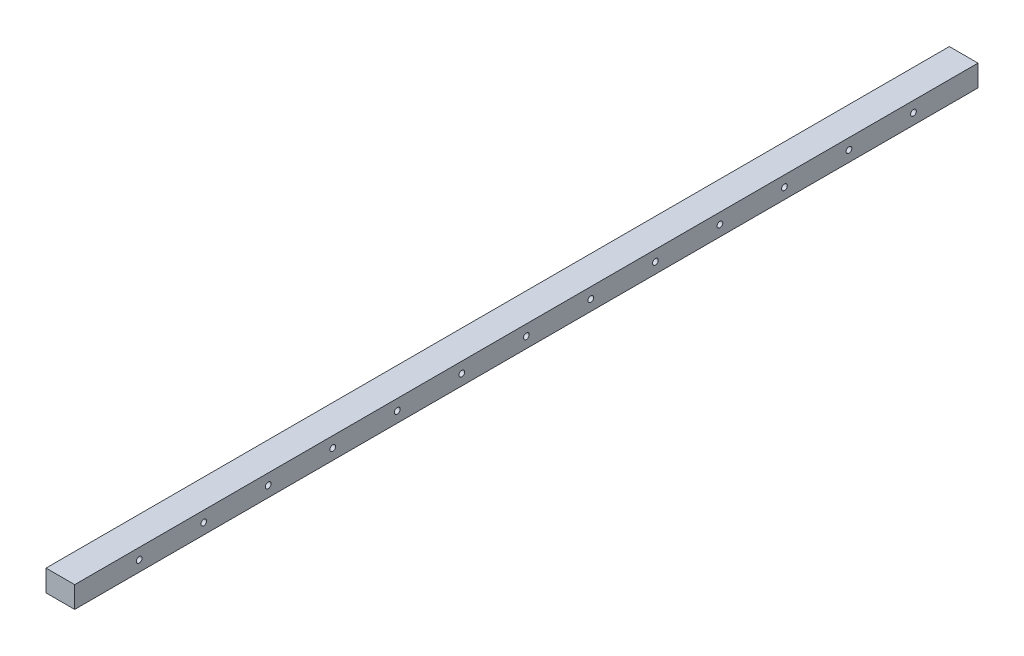
ISO-10303-21;
HEADER;
FILE_DESCRIPTION(('STEP AP214'),'2;1');
FILE_NAME('part.step','',(''),(''),'','','');
FILE_SCHEMA(('AUTOMOTIVE_DESIGN { 1 0 10303 214 1 1 1 1 }'));
ENDSEC;
DATA;
#1=APPLICATION_CONTEXT('core data for automotive mechanical design processes');
#2=APPLICATION_PROTOCOL_DEFINITION('international standard','automotive_design',2000,#1);
#3=PRODUCT_CONTEXT('',#1,'mechanical');
#4=PRODUCT('Part','Part','',(#3));
#5=PRODUCT_RELATED_PRODUCT_CATEGORY('part','',(#4));
#6=PRODUCT_DEFINITION_FORMATION('','',#4);
#7=PRODUCT_DEFINITION_CONTEXT('part definition',#1,'design');
#8=PRODUCT_DEFINITION('design','',#6,#7);
#9=PRODUCT_DEFINITION_SHAPE('','',#8);
#10=(LENGTH_UNIT() NAMED_UNIT(*) SI_UNIT(.MILLI.,.METRE.));
#11=(NAMED_UNIT(*) PLANE_ANGLE_UNIT() SI_UNIT($,.RADIAN.));
#12=(NAMED_UNIT(*) SI_UNIT($,.STERADIAN.) SOLID_ANGLE_UNIT());
#13=UNCERTAINTY_MEASURE_WITH_UNIT(LENGTH_MEASURE(1.E-05),#10,'distance_accuracy_value','');
#14=(GEOMETRIC_REPRESENTATION_CONTEXT(3) GLOBAL_UNCERTAINTY_ASSIGNED_CONTEXT((#13)) GLOBAL_UNIT_ASSIGNED_CONTEXT((#10,
#11,#12)) REPRESENTATION_CONTEXT('',''));
#15=CARTESIAN_POINT('',(0.,0.,0.));
#16=DIRECTION('',(0.,0.,1.));
#17=DIRECTION('',(1.,0.,0.));
#18=AXIS2_PLACEMENT_3D('',#15,#16,#17);
#19=CARTESIAN_POINT('',(380.,795.,-690.));
#20=DIRECTION('',(0.,0.,-1.));
#21=DIRECTION('',(0.,-1.,0.));
#22=AXIS2_PLACEMENT_3D('',#19,#20,#21);
#23=PLANE('',#22);
#24=DIRECTION('',(0.,1.,0.));
#25=VECTOR('',#24,1.);
#26=CARTESIAN_POINT('',(420.,795.,-690.));
#27=LINE('',#26,#25);
#28=CARTESIAN_POINT('',(420.,795.,-690.));
#29=VERTEX_POINT('',#28);
#30=CARTESIAN_POINT('',(420.,825.,-690.));
#31=VERTEX_POINT('',#30);
#32=EDGE_CURVE('E58',#29,#31,#27,.T.);
#33=ORIENTED_EDGE('',*,*,#32,.F.);
#34=DIRECTION('',(1.,0.,0.));
#35=VECTOR('',#34,1.);
#36=CARTESIAN_POINT('',(380.,795.,-690.));
#37=LINE('',#36,#35);
#38=CARTESIAN_POINT('',(380.,795.,-690.));
#39=VERTEX_POINT('',#38);
#40=EDGE_CURVE('E33',#39,#29,#37,.T.);
#41=ORIENTED_EDGE('',*,*,#40,.F.);
#42=DIRECTION('',(0.,1.,0.));
#43=VECTOR('',#42,1.);
#44=CARTESIAN_POINT('',(380.,795.,-690.));
#45=LINE('',#44,#43);
#46=CARTESIAN_POINT('',(380.,825.,-690.));
#47=VERTEX_POINT('',#46);
#48=EDGE_CURVE('E60',#39,#47,#45,.T.);
#49=ORIENTED_EDGE('',*,*,#48,.T.);
#50=DIRECTION('',(1.,0.,0.));
#51=VECTOR('',#50,1.);
#52=CARTESIAN_POINT('',(380.,825.,-690.));
#53=LINE('',#52,#51);
#54=EDGE_CURVE('E11',#47,#31,#53,.T.);
#55=ORIENTED_EDGE('',*,*,#54,.T.);
#56=EDGE_LOOP('',(#33,#41,#49,#55));
#57=FACE_BOUND('',#56,.T.);
#58=ADVANCED_FACE('F17',(#57),#23,.T.);
#59=CARTESIAN_POINT('',(380.,825.,-690.));
#60=DIRECTION('',(0.,1.,0.));
#61=DIRECTION('',(0.,0.,-1.));
#62=AXIS2_PLACEMENT_3D('',#59,#60,#61);
#63=PLANE('',#62);
#64=DIRECTION('',(0.,0.,1.));
#65=VECTOR('',#64,1.);
#66=CARTESIAN_POINT('',(420.,825.,-690.));
#67=LINE('',#66,#65);
#68=CARTESIAN_POINT('',(420.,825.,570.));
#69=VERTEX_POINT('',#68);
#70=EDGE_CURVE('E65',#31,#69,#67,.T.);
#71=ORIENTED_EDGE('',*,*,#70,.F.);
#72=ORIENTED_EDGE('',*,*,#54,.F.);
#73=DIRECTION('',(0.,0.,1.));
#74=VECTOR('',#73,1.);
#75=CARTESIAN_POINT('',(380.,825.,-690.));
#76=LINE('',#75,#74);
#77=CARTESIAN_POINT('',(380.,825.,570.));
#78=VERTEX_POINT('',#77);
#79=EDGE_CURVE('E83',#47,#78,#76,.T.);
#80=ORIENTED_EDGE('',*,*,#79,.T.);
#81=DIRECTION('',(1.,0.,0.));
#82=VECTOR('',#81,1.);
#83=CARTESIAN_POINT('',(380.,825.,570.));
#84=LINE('',#83,#82);
#85=EDGE_CURVE('E25',#78,#69,#84,.T.);
#86=ORIENTED_EDGE('',*,*,#85,.T.);
#87=EDGE_LOOP('',(#71,#72,#80,#86));
#88=FACE_BOUND('',#87,.T.);
#89=ADVANCED_FACE('F66',(#88),#63,.T.);
#90=CARTESIAN_POINT('',(380.,825.,570.));
#91=DIRECTION('',(0.,0.,1.));
#92=DIRECTION('',(0.,1.,0.));
#93=AXIS2_PLACEMENT_3D('',#90,#91,#92);
#94=PLANE('',#93);
#95=DIRECTION('',(0.,-1.,0.));
#96=VECTOR('',#95,1.);
#97=CARTESIAN_POINT('',(420.,825.,570.));
#98=LINE('',#97,#96);
#99=CARTESIAN_POINT('',(420.,795.,570.));
#100=VERTEX_POINT('',#99);
#101=EDGE_CURVE('E70',#69,#100,#98,.T.);
#102=ORIENTED_EDGE('',*,*,#101,.F.);
#103=ORIENTED_EDGE('',*,*,#85,.F.);
#104=DIRECTION('',(0.,-1.,0.));
#105=VECTOR('',#104,1.);
#106=CARTESIAN_POINT('',(380.,825.,570.));
#107=LINE('',#106,#105);
#108=CARTESIAN_POINT('',(380.,795.,570.));
#109=VERTEX_POINT('',#108);
#110=EDGE_CURVE('E85',#78,#109,#107,.T.);
#111=ORIENTED_EDGE('',*,*,#110,.T.);
#112=DIRECTION('',(1.,0.,0.));
#113=VECTOR('',#112,1.);
#114=CARTESIAN_POINT('',(380.,795.,570.));
#115=LINE('',#114,#113);
#116=EDGE_CURVE('E40',#109,#100,#115,.T.);
#117=ORIENTED_EDGE('',*,*,#116,.T.);
#118=EDGE_LOOP('',(#102,#103,#111,#117));
#119=FACE_BOUND('',#118,.T.);
#120=ADVANCED_FACE('F235',(#119),#94,.T.);
#121=CARTESIAN_POINT('',(380.,795.,570.));
#122=DIRECTION('',(0.,-1.,0.));
#123=DIRECTION('',(0.,0.,1.));
#124=AXIS2_PLACEMENT_3D('',#121,#122,#123);
#125=PLANE('',#124);
#126=DIRECTION('',(0.,0.,-1.));
#127=VECTOR('',#126,1.);
#128=CARTESIAN_POINT('',(420.,795.,570.));
#129=LINE('',#128,#127);
#130=EDGE_CURVE('E74',#100,#29,#129,.T.);
#131=ORIENTED_EDGE('',*,*,#130,.F.);
#132=ORIENTED_EDGE('',*,*,#116,.F.);
#133=DIRECTION('',(0.,0.,-1.));
#134=VECTOR('',#133,1.);
#135=CARTESIAN_POINT('',(380.,795.,570.));
#136=LINE('',#135,#134);
#137=EDGE_CURVE('E87',#109,#39,#136,.T.);
#138=ORIENTED_EDGE('',*,*,#137,.T.);
#139=ORIENTED_EDGE('',*,*,#40,.T.);
#140=EDGE_LOOP('',(#131,#132,#138,#139));
#141=FACE_BOUND('',#140,.T.);
#142=ADVANCED_FACE('F238',(#141),#125,.T.);
#143=CARTESIAN_POINT('',(380.,825.,-690.));
#144=DIRECTION('',(1.,0.,0.));
#145=DIRECTION('',(0.,1.,0.));
#146=AXIS2_PLACEMENT_3D('',#143,#144,#145);
#147=PLANE('',#146);
#148=CARTESIAN_POINT('',(380.,810.,-600.));
#149=DIRECTION('',(1.,0.,0.));
#150=DIRECTION('',(0.,0.,-1.));
#151=AXIS2_PLACEMENT_3D('',#148,#149,#150);
#152=CIRCLE('',#151,8.);
#153=CARTESIAN_POINT('',(380.,810.,-608.));
#154=VERTEX_POINT('',#153);
#155=EDGE_CURVE('E681',#154,#154,#152,.T.);
#156=ORIENTED_EDGE('',*,*,#155,.T.);
#157=EDGE_LOOP('',(#156));
#158=FACE_BOUND('',#157,.T.);
#159=CARTESIAN_POINT('',(380.,810.,480.));
#160=DIRECTION('',(1.,0.,0.));
#161=DIRECTION('',(0.,0.,-1.));
#162=AXIS2_PLACEMENT_3D('',#159,#160,#161);
#163=CIRCLE('',#162,8.);
#164=CARTESIAN_POINT('',(380.,810.,472.));
#165=VERTEX_POINT('',#164);
#166=EDGE_CURVE('E152',#165,#165,#163,.T.);
#167=ORIENTED_EDGE('',*,*,#166,.T.);
#168=EDGE_LOOP('',(#167));
#169=FACE_BOUND('',#168,.T.);
#170=CARTESIAN_POINT('',(380.,810.,390.));
#171=DIRECTION('',(1.,0.,0.));
#172=DIRECTION('',(0.,0.,-1.));
#173=AXIS2_PLACEMENT_3D('',#170,#171,#172);
#174=CIRCLE('',#173,8.);
#175=CARTESIAN_POINT('',(380.,810.,382.));
#176=VERTEX_POINT('',#175);
#177=EDGE_CURVE('E149',#176,#176,#174,.T.);
#178=ORIENTED_EDGE('',*,*,#177,.T.);
#179=EDGE_LOOP('',(#178));
#180=FACE_BOUND('',#179,.T.);
#181=CARTESIAN_POINT('',(380.,810.,300.));
#182=DIRECTION('',(1.,0.,0.));
#183=DIRECTION('',(0.,0.,-1.));
#184=AXIS2_PLACEMENT_3D('',#181,#182,#183);
#185=CIRCLE('',#184,8.);
#186=CARTESIAN_POINT('',(380.,810.,292.));
#187=VERTEX_POINT('',#186);
#188=EDGE_CURVE('E167',#187,#187,#185,.T.);
#189=ORIENTED_EDGE('',*,*,#188,.T.);
#190=EDGE_LOOP('',(#189));
#191=FACE_BOUND('',#190,.T.);
#192=CARTESIAN_POINT('',(380.,810.,210.));
#193=DIRECTION('',(1.,0.,0.));
#194=DIRECTION('',(0.,0.,-1.));
#195=AXIS2_PLACEMENT_3D('',#192,#193,#194);
#196=CIRCLE('',#195,8.);
#197=CARTESIAN_POINT('',(380.,810.,202.));
#198=VERTEX_POINT('',#197);
#199=EDGE_CURVE('E174',#198,#198,#196,.T.);
#200=ORIENTED_EDGE('',*,*,#199,.T.);
#201=EDGE_LOOP('',(#200));
#202=FACE_BOUND('',#201,.T.);
#203=CARTESIAN_POINT('',(380.,810.,120.));
#204=DIRECTION('',(1.,0.,0.));
#205=DIRECTION('',(0.,0.,-1.));
#206=AXIS2_PLACEMENT_3D('',#203,#204,#205);
#207=CIRCLE('',#206,8.);
#208=CARTESIAN_POINT('',(380.,810.,112.));
#209=VERTEX_POINT('',#208);
#210=EDGE_CURVE('E181',#209,#209,#207,.T.);
#211=ORIENTED_EDGE('',*,*,#210,.T.);
#212=EDGE_LOOP('',(#211));
#213=FACE_BOUND('',#212,.T.);
#214=CARTESIAN_POINT('',(380.,810.,29.9999999999996));
#215=DIRECTION('',(1.,0.,0.));
#216=DIRECTION('',(0.,0.,-1.));
#217=AXIS2_PLACEMENT_3D('',#214,#215,#216);
#218=CIRCLE('',#217,8.);
#219=CARTESIAN_POINT('',(380.,810.,21.9999999999996));
#220=VERTEX_POINT('',#219);
#221=EDGE_CURVE('E188',#220,#220,#218,.T.);
#222=ORIENTED_EDGE('',*,*,#221,.T.);
#223=EDGE_LOOP('',(#222));
#224=FACE_BOUND('',#223,.T.);
#225=CARTESIAN_POINT('',(380.,810.,-60.));
#226=DIRECTION('',(1.,0.,0.));
#227=DIRECTION('',(0.,0.,-1.));
#228=AXIS2_PLACEMENT_3D('',#225,#226,#227);
#229=CIRCLE('',#228,8.);
#230=CARTESIAN_POINT('',(380.,810.,-68.));
#231=VERTEX_POINT('',#230);
#232=EDGE_CURVE('E195',#231,#231,#229,.T.);
#233=ORIENTED_EDGE('',*,*,#232,.T.);
#234=EDGE_LOOP('',(#233));
#235=FACE_BOUND('',#234,.T.);
#236=CARTESIAN_POINT('',(380.,810.,-150.));
#237=DIRECTION('',(1.,0.,0.));
#238=DIRECTION('',(0.,0.,-1.));
#239=AXIS2_PLACEMENT_3D('',#236,#237,#238);
#240=CIRCLE('',#239,8.);
#241=CARTESIAN_POINT('',(380.,810.,-158.));
#242=VERTEX_POINT('',#241);
#243=EDGE_CURVE('E202',#242,#242,#240,.T.);
#244=ORIENTED_EDGE('',*,*,#243,.T.);
#245=EDGE_LOOP('',(#244));
#246=FACE_BOUND('',#245,.T.);
#247=CARTESIAN_POINT('',(380.,810.,-240.));
#248=DIRECTION('',(1.,0.,0.));
#249=DIRECTION('',(0.,0.,-1.));
#250=AXIS2_PLACEMENT_3D('',#247,#248,#249);
#251=CIRCLE('',#250,8.);
#252=CARTESIAN_POINT('',(380.,810.,-248.));
#253=VERTEX_POINT('',#252);
#254=EDGE_CURVE('E209',#253,#253,#251,.T.);
#255=ORIENTED_EDGE('',*,*,#254,.T.);
#256=EDGE_LOOP('',(#255));
#257=FACE_BOUND('',#256,.T.);
#258=CARTESIAN_POINT('',(380.,810.,-330.));
#259=DIRECTION('',(1.,0.,0.));
#260=DIRECTION('',(0.,0.,-1.));
#261=AXIS2_PLACEMENT_3D('',#258,#259,#260);
#262=CIRCLE('',#261,8.);
#263=CARTESIAN_POINT('',(380.,810.,-338.));
#264=VERTEX_POINT('',#263);
#265=EDGE_CURVE('E216',#264,#264,#262,.T.);
#266=ORIENTED_EDGE('',*,*,#265,.T.);
#267=EDGE_LOOP('',(#266));
#268=FACE_BOUND('',#267,.T.);
#269=CARTESIAN_POINT('',(380.,810.,-420.));
#270=DIRECTION('',(1.,0.,0.));
#271=DIRECTION('',(0.,0.,-1.));
#272=AXIS2_PLACEMENT_3D('',#269,#270,#271);
#273=CIRCLE('',#272,8.);
#274=CARTESIAN_POINT('',(380.,810.,-428.));
#275=VERTEX_POINT('',#274);
#276=EDGE_CURVE('E223',#275,#275,#273,.T.);
#277=ORIENTED_EDGE('',*,*,#276,.T.);
#278=EDGE_LOOP('',(#277));
#279=FACE_BOUND('',#278,.T.);
#280=CARTESIAN_POINT('',(380.,810.,-510.));
#281=DIRECTION('',(1.,0.,0.));
#282=DIRECTION('',(0.,0.,-1.));
#283=AXIS2_PLACEMENT_3D('',#280,#281,#282);
#284=CIRCLE('',#283,8.);
#285=CARTESIAN_POINT('',(380.,810.,-518.));
#286=VERTEX_POINT('',#285);
#287=EDGE_CURVE('E230',#286,#286,#284,.T.);
#288=ORIENTED_EDGE('',*,*,#287,.T.);
#289=EDGE_LOOP('',(#288));
#290=FACE_BOUND('',#289,.T.);
#291=ORIENTED_EDGE('',*,*,#48,.F.);
#292=ORIENTED_EDGE('',*,*,#137,.F.);
#293=ORIENTED_EDGE('',*,*,#110,.F.);
#294=ORIENTED_EDGE('',*,*,#79,.F.);
#295=EDGE_LOOP('',(#291,#292,#293,#294));
#296=FACE_BOUND('',#295,.T.);
#297=ADVANCED_FACE('F240',(#158,#169,#180,#191,#202,#213,#224,#235,#246,#257,#268,#279,#290,
#296),#147,.F.);
#298=CARTESIAN_POINT('',(420.,825.,-690.));
#299=DIRECTION('',(1.,0.,0.));
#300=DIRECTION('',(0.,1.,0.));
#301=AXIS2_PLACEMENT_3D('',#298,#299,#300);
#302=PLANE('',#301);
#303=CARTESIAN_POINT('',(420.,810.,-600.));
#304=DIRECTION('',(1.,0.,0.));
#305=DIRECTION('',(0.,0.,-1.));
#306=AXIS2_PLACEMENT_3D('',#303,#304,#305);
#307=CIRCLE('',#306,4.);
#308=CARTESIAN_POINT('',(420.,810.,-604.));
#309=VERTEX_POINT('',#308);
#310=EDGE_CURVE('E20',#309,#309,#307,.T.);
#311=ORIENTED_EDGE('',*,*,#310,.F.);
#312=EDGE_LOOP('',(#311));
#313=FACE_BOUND('',#312,.T.);
#314=CARTESIAN_POINT('',(420.,810.,480.));
#315=DIRECTION('',(1.,0.,0.));
#316=DIRECTION('',(0.,0.,-1.));
#317=AXIS2_PLACEMENT_3D('',#314,#315,#316);
#318=CIRCLE('',#317,4.);
#319=CARTESIAN_POINT('',(420.,810.,476.));
#320=VERTEX_POINT('',#319);
#321=EDGE_CURVE('E142',#320,#320,#318,.T.);
#322=ORIENTED_EDGE('',*,*,#321,.F.);
#323=EDGE_LOOP('',(#322));
#324=FACE_BOUND('',#323,.T.);
#325=CARTESIAN_POINT('',(420.,810.,390.));
#326=DIRECTION('',(1.,0.,0.));
#327=DIRECTION('',(0.,0.,-1.));
#328=AXIS2_PLACEMENT_3D('',#325,#326,#327);
#329=CIRCLE('',#328,4.);
#330=CARTESIAN_POINT('',(420.,810.,386.));
#331=VERTEX_POINT('',#330);
#332=EDGE_CURVE('E138',#331,#331,#329,.T.);
#333=ORIENTED_EDGE('',*,*,#332,.F.);
#334=EDGE_LOOP('',(#333));
#335=FACE_BOUND('',#334,.T.);
#336=CARTESIAN_POINT('',(420.,810.,300.));
#337=DIRECTION('',(1.,0.,0.));
#338=DIRECTION('',(0.,0.,-1.));
#339=AXIS2_PLACEMENT_3D('',#336,#337,#338);
#340=CIRCLE('',#339,4.);
#341=CARTESIAN_POINT('',(420.,810.,296.));
#342=VERTEX_POINT('',#341);
#343=EDGE_CURVE('E133',#342,#342,#340,.T.);
#344=ORIENTED_EDGE('',*,*,#343,.F.);
#345=EDGE_LOOP('',(#344));
#346=FACE_BOUND('',#345,.T.);
#347=CARTESIAN_POINT('',(420.,810.,210.));
#348=DIRECTION('',(1.,0.,0.));
#349=DIRECTION('',(0.,0.,-1.));
#350=AXIS2_PLACEMENT_3D('',#347,#348,#349);
#351=CIRCLE('',#350,4.);
#352=CARTESIAN_POINT('',(420.,810.,206.));
#353=VERTEX_POINT('',#352);
#354=EDGE_CURVE('E128',#353,#353,#351,.T.);
#355=ORIENTED_EDGE('',*,*,#354,.F.);
#356=EDGE_LOOP('',(#355));
#357=FACE_BOUND('',#356,.T.);
#358=CARTESIAN_POINT('',(420.,810.,120.));
#359=DIRECTION('',(1.,0.,0.));
#360=DIRECTION('',(0.,0.,-1.));
#361=AXIS2_PLACEMENT_3D('',#358,#359,#360);
#362=CIRCLE('',#361,4.);
#363=CARTESIAN_POINT('',(420.,810.,116.));
#364=VERTEX_POINT('',#363);
#365=EDGE_CURVE('E123',#364,#364,#362,.T.);
#366=ORIENTED_EDGE('',*,*,#365,.F.);
#367=EDGE_LOOP('',(#366));
#368=FACE_BOUND('',#367,.T.);
#369=CARTESIAN_POINT('',(420.,810.,29.9999999999996));
#370=DIRECTION('',(1.,0.,0.));
#371=DIRECTION('',(0.,0.,-1.));
#372=AXIS2_PLACEMENT_3D('',#369,#370,#371);
#373=CIRCLE('',#372,4.);
#374=CARTESIAN_POINT('',(420.,810.,25.9999999999996));
#375=VERTEX_POINT('',#374);
#376=EDGE_CURVE('E118',#375,#375,#373,.T.);
#377=ORIENTED_EDGE('',*,*,#376,.F.);
#378=EDGE_LOOP('',(#377));
#379=FACE_BOUND('',#378,.T.);
#380=CARTESIAN_POINT('',(420.,810.,-60.));
#381=DIRECTION('',(1.,0.,0.));
#382=DIRECTION('',(0.,0.,-1.));
#383=AXIS2_PLACEMENT_3D('',#380,#381,#382);
#384=CIRCLE('',#383,4.);
#385=CARTESIAN_POINT('',(420.,810.,-64.));
#386=VERTEX_POINT('',#385);
#387=EDGE_CURVE('E113',#386,#386,#384,.T.);
#388=ORIENTED_EDGE('',*,*,#387,.F.);
#389=EDGE_LOOP('',(#388));
#390=FACE_BOUND('',#389,.T.);
#391=CARTESIAN_POINT('',(420.,810.,-150.));
#392=DIRECTION('',(1.,0.,0.));
#393=DIRECTION('',(0.,0.,-1.));
#394=AXIS2_PLACEMENT_3D('',#391,#392,#393);
#395=CIRCLE('',#394,4.);
#396=CARTESIAN_POINT('',(420.,810.,-154.));
#397=VERTEX_POINT('',#396);
#398=EDGE_CURVE('E108',#397,#397,#395,.T.);
#399=ORIENTED_EDGE('',*,*,#398,.F.);
#400=EDGE_LOOP('',(#399));
#401=FACE_BOUND('',#400,.T.);
#402=CARTESIAN_POINT('',(420.,810.,-240.));
#403=DIRECTION('',(1.,0.,0.));
#404=DIRECTION('',(0.,0.,-1.));
#405=AXIS2_PLACEMENT_3D('',#402,#403,#404);
#406=CIRCLE('',#405,4.);
#407=CARTESIAN_POINT('',(420.,810.,-244.));
#408=VERTEX_POINT('',#407);
#409=EDGE_CURVE('E103',#408,#408,#406,.T.);
#410=ORIENTED_EDGE('',*,*,#409,.F.);
#411=EDGE_LOOP('',(#410));
#412=FACE_BOUND('',#411,.T.);
#413=CARTESIAN_POINT('',(420.,810.,-330.));
#414=DIRECTION('',(1.,0.,0.));
#415=DIRECTION('',(0.,0.,-1.));
#416=AXIS2_PLACEMENT_3D('',#413,#414,#415);
#417=CIRCLE('',#416,4.);
#418=CARTESIAN_POINT('',(420.,810.,-334.));
#419=VERTEX_POINT('',#418);
#420=EDGE_CURVE('E98',#419,#419,#417,.T.);
#421=ORIENTED_EDGE('',*,*,#420,.F.);
#422=EDGE_LOOP('',(#421));
#423=FACE_BOUND('',#422,.T.);
#424=CARTESIAN_POINT('',(420.,810.,-420.));
#425=DIRECTION('',(1.,0.,0.));
#426=DIRECTION('',(0.,0.,-1.));
#427=AXIS2_PLACEMENT_3D('',#424,#425,#426);
#428=CIRCLE('',#427,4.);
#429=CARTESIAN_POINT('',(420.,810.,-424.));
#430=VERTEX_POINT('',#429);
#431=EDGE_CURVE('E93',#430,#430,#428,.T.);
#432=ORIENTED_EDGE('',*,*,#431,.F.);
#433=EDGE_LOOP('',(#432));
#434=FACE_BOUND('',#433,.T.);
#435=CARTESIAN_POINT('',(420.,810.,-510.));
#436=DIRECTION('',(1.,0.,0.));
#437=DIRECTION('',(0.,0.,-1.));
#438=AXIS2_PLACEMENT_3D('',#435,#436,#437);
#439=CIRCLE('',#438,4.);
#440=CARTESIAN_POINT('',(420.,810.,-514.));
#441=VERTEX_POINT('',#440);
#442=EDGE_CURVE('E75',#441,#441,#439,.T.);
#443=ORIENTED_EDGE('',*,*,#442,.F.);
#444=EDGE_LOOP('',(#443));
#445=FACE_BOUND('',#444,.T.);
#446=ORIENTED_EDGE('',*,*,#32,.T.);
#447=ORIENTED_EDGE('',*,*,#70,.T.);
#448=ORIENTED_EDGE('',*,*,#101,.T.);
#449=ORIENTED_EDGE('',*,*,#130,.T.);
#450=EDGE_LOOP('',(#446,#447,#448,#449));
#451=FACE_BOUND('',#450,.T.);
#452=ADVANCED_FACE('F73',(#313,#324,#335,#346,#357,#368,#379,#390,#401,#412,#423,#434,#445,
#451),#302,.T.);
#453=CARTESIAN_POINT('',(424.000000000182,810.,-510.));
#454=DIRECTION('',(-1.,0.,0.));
#455=DIRECTION('',(0.,0.,-1.));
#456=AXIS2_PLACEMENT_3D('',#453,#454,#455);
#457=CYLINDRICAL_SURFACE('',#456,4.);
#458=ORIENTED_EDGE('',*,*,#442,.T.);
#459=EDGE_LOOP('',(#458));
#460=FACE_BOUND('',#459,.T.);
#461=CARTESIAN_POINT('',(385.,810.,-510.));
#462=DIRECTION('',(1.,0.,0.));
#463=DIRECTION('',(0.,0.,-1.));
#464=AXIS2_PLACEMENT_3D('',#461,#462,#463);
#465=CIRCLE('',#464,4.);
#466=CARTESIAN_POINT('',(385.,810.,-514.));
#467=VERTEX_POINT('',#466);
#468=EDGE_CURVE('E78',#467,#467,#465,.F.);
#469=ORIENTED_EDGE('',*,*,#468,.T.);
#470=EDGE_LOOP('',(#469));
#471=FACE_BOUND('',#470,.T.);
#472=ADVANCED_FACE('F249',(#460,#471),#457,.F.);
#473=CARTESIAN_POINT('',(385.,810.,-510.));
#474=DIRECTION('',(1.,0.,0.));
#475=DIRECTION('',(0.,0.,-1.));
#476=AXIS2_PLACEMENT_3D('',#473,#474,#475);
#477=PLANE('',#476);
#478=ORIENTED_EDGE('',*,*,#468,.F.);
#479=EDGE_LOOP('',(#478));
#480=FACE_BOUND('',#479,.T.);
#481=CARTESIAN_POINT('',(385.,810.,-510.));
#482=DIRECTION('',(-1.,0.,0.));
#483=DIRECTION('',(0.,0.,-1.));
#484=AXIS2_PLACEMENT_3D('',#481,#482,#483);
#485=CIRCLE('',#484,8.);
#486=CARTESIAN_POINT('',(385.,810.,-518.));
#487=VERTEX_POINT('',#486);
#488=EDGE_CURVE('E96',#487,#487,#485,.T.);
#489=ORIENTED_EDGE('',*,*,#488,.T.);
#490=EDGE_LOOP('',(#489));
#491=FACE_BOUND('',#490,.T.);
#492=ADVANCED_FACE('F296',(#480,#491),#477,.F.);
#493=CARTESIAN_POINT('',(385.,810.,-510.));
#494=DIRECTION('',(-1.,0.,0.));
#495=DIRECTION('',(0.,0.,-1.));
#496=AXIS2_PLACEMENT_3D('',#493,#494,#495);
#497=CYLINDRICAL_SURFACE('',#496,8.);
#498=ORIENTED_EDGE('',*,*,#287,.F.);
#499=EDGE_LOOP('',(#498));
#500=FACE_BOUND('',#499,.T.);
#501=ORIENTED_EDGE('',*,*,#488,.F.);
#502=EDGE_LOOP('',(#501));
#503=FACE_BOUND('',#502,.T.);
#504=ADVANCED_FACE('F306',(#500,#503),#497,.F.);
#505=CARTESIAN_POINT('',(424.000000000182,810.,-420.));
#506=DIRECTION('',(-1.,0.,0.));
#507=DIRECTION('',(0.,0.,-1.));
#508=AXIS2_PLACEMENT_3D('',#505,#506,#507);
#509=CYLINDRICAL_SURFACE('',#508,4.);
#510=ORIENTED_EDGE('',*,*,#431,.T.);
#511=EDGE_LOOP('',(#510));
#512=FACE_BOUND('',#511,.T.);
#513=CARTESIAN_POINT('',(385.,810.,-420.));
#514=DIRECTION('',(1.,0.,0.));
#515=DIRECTION('',(0.,0.,-1.));
#516=AXIS2_PLACEMENT_3D('',#513,#514,#515);
#517=CIRCLE('',#516,4.);
#518=CARTESIAN_POINT('',(385.,810.,-424.));
#519=VERTEX_POINT('',#518);
#520=EDGE_CURVE('E97',#519,#519,#517,.F.);
#521=ORIENTED_EDGE('',*,*,#520,.T.);
#522=EDGE_LOOP('',(#521));
#523=FACE_BOUND('',#522,.T.);
#524=ADVANCED_FACE('F316',(#512,#523),#509,.F.);
#525=CARTESIAN_POINT('',(385.,810.,-420.));
#526=DIRECTION('',(1.,0.,0.));
#527=DIRECTION('',(0.,0.,-1.));
#528=AXIS2_PLACEMENT_3D('',#525,#526,#527);
#529=PLANE('',#528);
#530=ORIENTED_EDGE('',*,*,#520,.F.);
#531=EDGE_LOOP('',(#530));
#532=FACE_BOUND('',#531,.T.);
#533=CARTESIAN_POINT('',(385.,810.,-420.));
#534=DIRECTION('',(-1.,0.,0.));
#535=DIRECTION('',(0.,0.,-1.));
#536=AXIS2_PLACEMENT_3D('',#533,#534,#535);
#537=CIRCLE('',#536,8.);
#538=CARTESIAN_POINT('',(385.,810.,-428.));
#539=VERTEX_POINT('',#538);
#540=EDGE_CURVE('E101',#539,#539,#537,.T.);
#541=ORIENTED_EDGE('',*,*,#540,.T.);
#542=EDGE_LOOP('',(#541));
#543=FACE_BOUND('',#542,.T.);
#544=ADVANCED_FACE('F326',(#532,#543),#529,.F.);
#545=CARTESIAN_POINT('',(385.,810.,-420.));
#546=DIRECTION('',(-1.,0.,0.));
#547=DIRECTION('',(0.,0.,-1.));
#548=AXIS2_PLACEMENT_3D('',#545,#546,#547);
#549=CYLINDRICAL_SURFACE('',#548,8.);
#550=ORIENTED_EDGE('',*,*,#276,.F.);
#551=EDGE_LOOP('',(#550));
#552=FACE_BOUND('',#551,.T.);
#553=ORIENTED_EDGE('',*,*,#540,.F.);
#554=EDGE_LOOP('',(#553));
#555=FACE_BOUND('',#554,.T.);
#556=ADVANCED_FACE('F336',(#552,#555),#549,.F.);
#557=CARTESIAN_POINT('',(424.000000000182,810.,-330.));
#558=DIRECTION('',(-1.,0.,0.));
#559=DIRECTION('',(0.,0.,-1.));
#560=AXIS2_PLACEMENT_3D('',#557,#558,#559);
#561=CYLINDRICAL_SURFACE('',#560,4.);
#562=ORIENTED_EDGE('',*,*,#420,.T.);
#563=EDGE_LOOP('',(#562));
#564=FACE_BOUND('',#563,.T.);
#565=CARTESIAN_POINT('',(385.,810.,-330.));
#566=DIRECTION('',(1.,0.,0.));
#567=DIRECTION('',(0.,0.,-1.));
#568=AXIS2_PLACEMENT_3D('',#565,#566,#567);
#569=CIRCLE('',#568,4.);
#570=CARTESIAN_POINT('',(385.,810.,-334.));
#571=VERTEX_POINT('',#570);
#572=EDGE_CURVE('E102',#571,#571,#569,.F.);
#573=ORIENTED_EDGE('',*,*,#572,.T.);
#574=EDGE_LOOP('',(#573));
#575=FACE_BOUND('',#574,.T.);
#576=ADVANCED_FACE('F346',(#564,#575),#561,.F.);
#577=CARTESIAN_POINT('',(385.,810.,-330.));
#578=DIRECTION('',(1.,0.,0.));
#579=DIRECTION('',(0.,0.,-1.));
#580=AXIS2_PLACEMENT_3D('',#577,#578,#579);
#581=PLANE('',#580);
#582=ORIENTED_EDGE('',*,*,#572,.F.);
#583=EDGE_LOOP('',(#582));
#584=FACE_BOUND('',#583,.T.);
#585=CARTESIAN_POINT('',(385.,810.,-330.));
#586=DIRECTION('',(-1.,0.,0.));
#587=DIRECTION('',(0.,0.,-1.));
#588=AXIS2_PLACEMENT_3D('',#585,#586,#587);
#589=CIRCLE('',#588,8.);
#590=CARTESIAN_POINT('',(385.,810.,-338.));
#591=VERTEX_POINT('',#590);
#592=EDGE_CURVE('E106',#591,#591,#589,.T.);
#593=ORIENTED_EDGE('',*,*,#592,.T.);
#594=EDGE_LOOP('',(#593));
#595=FACE_BOUND('',#594,.T.);
#596=ADVANCED_FACE('F356',(#584,#595),#581,.F.);
#597=CARTESIAN_POINT('',(385.,810.,-330.));
#598=DIRECTION('',(-1.,0.,0.));
#599=DIRECTION('',(0.,0.,-1.));
#600=AXIS2_PLACEMENT_3D('',#597,#598,#599);
#601=CYLINDRICAL_SURFACE('',#600,8.);
#602=ORIENTED_EDGE('',*,*,#265,.F.);
#603=EDGE_LOOP('',(#602));
#604=FACE_BOUND('',#603,.T.);
#605=ORIENTED_EDGE('',*,*,#592,.F.);
#606=EDGE_LOOP('',(#605));
#607=FACE_BOUND('',#606,.T.);
#608=ADVANCED_FACE('F366',(#604,#607),#601,.F.);
#609=CARTESIAN_POINT('',(424.000000000182,810.,-240.));
#610=DIRECTION('',(-1.,0.,0.));
#611=DIRECTION('',(0.,0.,-1.));
#612=AXIS2_PLACEMENT_3D('',#609,#610,#611);
#613=CYLINDRICAL_SURFACE('',#612,4.);
#614=ORIENTED_EDGE('',*,*,#409,.T.);
#615=EDGE_LOOP('',(#614));
#616=FACE_BOUND('',#615,.T.);
#617=CARTESIAN_POINT('',(385.,810.,-240.));
#618=DIRECTION('',(1.,0.,0.));
#619=DIRECTION('',(0.,0.,-1.));
#620=AXIS2_PLACEMENT_3D('',#617,#618,#619);
#621=CIRCLE('',#620,4.);
#622=CARTESIAN_POINT('',(385.,810.,-244.));
#623=VERTEX_POINT('',#622);
#624=EDGE_CURVE('E107',#623,#623,#621,.F.);
#625=ORIENTED_EDGE('',*,*,#624,.T.);
#626=EDGE_LOOP('',(#625));
#627=FACE_BOUND('',#626,.T.);
#628=ADVANCED_FACE('F376',(#616,#627),#613,.F.);
#629=CARTESIAN_POINT('',(385.,810.,-240.));
#630=DIRECTION('',(1.,0.,0.));
#631=DIRECTION('',(0.,0.,-1.));
#632=AXIS2_PLACEMENT_3D('',#629,#630,#631);
#633=PLANE('',#632);
#634=ORIENTED_EDGE('',*,*,#624,.F.);
#635=EDGE_LOOP('',(#634));
#636=FACE_BOUND('',#635,.T.);
#637=CARTESIAN_POINT('',(385.,810.,-240.));
#638=DIRECTION('',(-1.,0.,0.));
#639=DIRECTION('',(0.,0.,-1.));
#640=AXIS2_PLACEMENT_3D('',#637,#638,#639);
#641=CIRCLE('',#640,8.);
#642=CARTESIAN_POINT('',(385.,810.,-248.));
#643=VERTEX_POINT('',#642);
#644=EDGE_CURVE('E111',#643,#643,#641,.T.);
#645=ORIENTED_EDGE('',*,*,#644,.T.);
#646=EDGE_LOOP('',(#645));
#647=FACE_BOUND('',#646,.T.);
#648=ADVANCED_FACE('F386',(#636,#647),#633,.F.);
#649=CARTESIAN_POINT('',(385.,810.,-240.));
#650=DIRECTION('',(-1.,0.,0.));
#651=DIRECTION('',(0.,0.,-1.));
#652=AXIS2_PLACEMENT_3D('',#649,#650,#651);
#653=CYLINDRICAL_SURFACE('',#652,8.);
#654=ORIENTED_EDGE('',*,*,#254,.F.);
#655=EDGE_LOOP('',(#654));
#656=FACE_BOUND('',#655,.T.);
#657=ORIENTED_EDGE('',*,*,#644,.F.);
#658=EDGE_LOOP('',(#657));
#659=FACE_BOUND('',#658,.T.);
#660=ADVANCED_FACE('F396',(#656,#659),#653,.F.);
#661=CARTESIAN_POINT('',(424.000000000182,810.,-150.));
#662=DIRECTION('',(-1.,0.,0.));
#663=DIRECTION('',(0.,0.,-1.));
#664=AXIS2_PLACEMENT_3D('',#661,#662,#663);
#665=CYLINDRICAL_SURFACE('',#664,4.);
#666=ORIENTED_EDGE('',*,*,#398,.T.);
#667=EDGE_LOOP('',(#666));
#668=FACE_BOUND('',#667,.T.);
#669=CARTESIAN_POINT('',(385.,810.,-150.));
#670=DIRECTION('',(1.,0.,0.));
#671=DIRECTION('',(0.,0.,-1.));
#672=AXIS2_PLACEMENT_3D('',#669,#670,#671);
#673=CIRCLE('',#672,4.);
#674=CARTESIAN_POINT('',(385.,810.,-154.));
#675=VERTEX_POINT('',#674);
#676=EDGE_CURVE('E112',#675,#675,#673,.F.);
#677=ORIENTED_EDGE('',*,*,#676,.T.);
#678=EDGE_LOOP('',(#677));
#679=FACE_BOUND('',#678,.T.);
#680=ADVANCED_FACE('F406',(#668,#679),#665,.F.);
#681=CARTESIAN_POINT('',(385.,810.,-150.));
#682=DIRECTION('',(1.,0.,0.));
#683=DIRECTION('',(0.,0.,-1.));
#684=AXIS2_PLACEMENT_3D('',#681,#682,#683);
#685=PLANE('',#684);
#686=ORIENTED_EDGE('',*,*,#676,.F.);
#687=EDGE_LOOP('',(#686));
#688=FACE_BOUND('',#687,.T.);
#689=CARTESIAN_POINT('',(385.,810.,-150.));
#690=DIRECTION('',(-1.,0.,0.));
#691=DIRECTION('',(0.,0.,-1.));
#692=AXIS2_PLACEMENT_3D('',#689,#690,#691);
#693=CIRCLE('',#692,8.);
#694=CARTESIAN_POINT('',(385.,810.,-158.));
#695=VERTEX_POINT('',#694);
#696=EDGE_CURVE('E116',#695,#695,#693,.T.);
#697=ORIENTED_EDGE('',*,*,#696,.T.);
#698=EDGE_LOOP('',(#697));
#699=FACE_BOUND('',#698,.T.);
#700=ADVANCED_FACE('F416',(#688,#699),#685,.F.);
#701=CARTESIAN_POINT('',(385.,810.,-150.));
#702=DIRECTION('',(-1.,0.,0.));
#703=DIRECTION('',(0.,0.,-1.));
#704=AXIS2_PLACEMENT_3D('',#701,#702,#703);
#705=CYLINDRICAL_SURFACE('',#704,8.);
#706=ORIENTED_EDGE('',*,*,#243,.F.);
#707=EDGE_LOOP('',(#706));
#708=FACE_BOUND('',#707,.T.);
#709=ORIENTED_EDGE('',*,*,#696,.F.);
#710=EDGE_LOOP('',(#709));
#711=FACE_BOUND('',#710,.T.);
#712=ADVANCED_FACE('F426',(#708,#711),#705,.F.);
#713=CARTESIAN_POINT('',(424.000000000182,810.,-60.));
#714=DIRECTION('',(-1.,0.,0.));
#715=DIRECTION('',(0.,0.,-1.));
#716=AXIS2_PLACEMENT_3D('',#713,#714,#715);
#717=CYLINDRICAL_SURFACE('',#716,4.);
#718=ORIENTED_EDGE('',*,*,#387,.T.);
#719=EDGE_LOOP('',(#718));
#720=FACE_BOUND('',#719,.T.);
#721=CARTESIAN_POINT('',(385.,810.,-60.));
#722=DIRECTION('',(1.,0.,0.));
#723=DIRECTION('',(0.,0.,-1.));
#724=AXIS2_PLACEMENT_3D('',#721,#722,#723);
#725=CIRCLE('',#724,4.);
#726=CARTESIAN_POINT('',(385.,810.,-64.));
#727=VERTEX_POINT('',#726);
#728=EDGE_CURVE('E117',#727,#727,#725,.F.);
#729=ORIENTED_EDGE('',*,*,#728,.T.);
#730=EDGE_LOOP('',(#729));
#731=FACE_BOUND('',#730,.T.);
#732=ADVANCED_FACE('F436',(#720,#731),#717,.F.);
#733=CARTESIAN_POINT('',(385.,810.,-60.));
#734=DIRECTION('',(1.,0.,0.));
#735=DIRECTION('',(0.,0.,-1.));
#736=AXIS2_PLACEMENT_3D('',#733,#734,#735);
#737=PLANE('',#736);
#738=ORIENTED_EDGE('',*,*,#728,.F.);
#739=EDGE_LOOP('',(#738));
#740=FACE_BOUND('',#739,.T.);
#741=CARTESIAN_POINT('',(385.,810.,-60.));
#742=DIRECTION('',(-1.,0.,0.));
#743=DIRECTION('',(0.,0.,-1.));
#744=AXIS2_PLACEMENT_3D('',#741,#742,#743);
#745=CIRCLE('',#744,8.);
#746=CARTESIAN_POINT('',(385.,810.,-68.));
#747=VERTEX_POINT('',#746);
#748=EDGE_CURVE('E121',#747,#747,#745,.T.);
#749=ORIENTED_EDGE('',*,*,#748,.T.);
#750=EDGE_LOOP('',(#749));
#751=FACE_BOUND('',#750,.T.);
#752=ADVANCED_FACE('F446',(#740,#751),#737,.F.);
#753=CARTESIAN_POINT('',(385.,810.,-60.));
#754=DIRECTION('',(-1.,0.,0.));
#755=DIRECTION('',(0.,0.,-1.));
#756=AXIS2_PLACEMENT_3D('',#753,#754,#755);
#757=CYLINDRICAL_SURFACE('',#756,8.);
#758=ORIENTED_EDGE('',*,*,#232,.F.);
#759=EDGE_LOOP('',(#758));
#760=FACE_BOUND('',#759,.T.);
#761=ORIENTED_EDGE('',*,*,#748,.F.);
#762=EDGE_LOOP('',(#761));
#763=FACE_BOUND('',#762,.T.);
#764=ADVANCED_FACE('F456',(#760,#763),#757,.F.);
#765=CARTESIAN_POINT('',(424.000000000182,810.,29.9999999999996));
#766=DIRECTION('',(-1.,0.,0.));
#767=DIRECTION('',(0.,0.,-1.));
#768=AXIS2_PLACEMENT_3D('',#765,#766,#767);
#769=CYLINDRICAL_SURFACE('',#768,4.);
#770=ORIENTED_EDGE('',*,*,#376,.T.);
#771=EDGE_LOOP('',(#770));
#772=FACE_BOUND('',#771,.T.);
#773=CARTESIAN_POINT('',(385.,810.,29.9999999999996));
#774=DIRECTION('',(1.,0.,0.));
#775=DIRECTION('',(0.,0.,-1.));
#776=AXIS2_PLACEMENT_3D('',#773,#774,#775);
#777=CIRCLE('',#776,4.);
#778=CARTESIAN_POINT('',(385.,810.,25.9999999999996));
#779=VERTEX_POINT('',#778);
#780=EDGE_CURVE('E122',#779,#779,#777,.F.);
#781=ORIENTED_EDGE('',*,*,#780,.T.);
#782=EDGE_LOOP('',(#781));
#783=FACE_BOUND('',#782,.T.);
#784=ADVANCED_FACE('F466',(#772,#783),#769,.F.);
#785=CARTESIAN_POINT('',(385.,810.,29.9999999999996));
#786=DIRECTION('',(1.,0.,0.));
#787=DIRECTION('',(0.,0.,-1.));
#788=AXIS2_PLACEMENT_3D('',#785,#786,#787);
#789=PLANE('',#788);
#790=ORIENTED_EDGE('',*,*,#780,.F.);
#791=EDGE_LOOP('',(#790));
#792=FACE_BOUND('',#791,.T.);
#793=CARTESIAN_POINT('',(385.,810.,29.9999999999996));
#794=DIRECTION('',(-1.,0.,0.));
#795=DIRECTION('',(0.,0.,-1.));
#796=AXIS2_PLACEMENT_3D('',#793,#794,#795);
#797=CIRCLE('',#796,8.);
#798=CARTESIAN_POINT('',(385.,810.,21.9999999999996));
#799=VERTEX_POINT('',#798);
#800=EDGE_CURVE('E126',#799,#799,#797,.T.);
#801=ORIENTED_EDGE('',*,*,#800,.T.);
#802=EDGE_LOOP('',(#801));
#803=FACE_BOUND('',#802,.T.);
#804=ADVANCED_FACE('F476',(#792,#803),#789,.F.);
#805=CARTESIAN_POINT('',(385.,810.,29.9999999999996));
#806=DIRECTION('',(-1.,0.,0.));
#807=DIRECTION('',(0.,0.,-1.));
#808=AXIS2_PLACEMENT_3D('',#805,#806,#807);
#809=CYLINDRICAL_SURFACE('',#808,8.);
#810=ORIENTED_EDGE('',*,*,#221,.F.);
#811=EDGE_LOOP('',(#810));
#812=FACE_BOUND('',#811,.T.);
#813=ORIENTED_EDGE('',*,*,#800,.F.);
#814=EDGE_LOOP('',(#813));
#815=FACE_BOUND('',#814,.T.);
#816=ADVANCED_FACE('F486',(#812,#815),#809,.F.);
#817=CARTESIAN_POINT('',(424.000000000182,810.,120.));
#818=DIRECTION('',(-1.,0.,0.));
#819=DIRECTION('',(0.,0.,-1.));
#820=AXIS2_PLACEMENT_3D('',#817,#818,#819);
#821=CYLINDRICAL_SURFACE('',#820,4.);
#822=ORIENTED_EDGE('',*,*,#365,.T.);
#823=EDGE_LOOP('',(#822));
#824=FACE_BOUND('',#823,.T.);
#825=CARTESIAN_POINT('',(385.,810.,120.));
#826=DIRECTION('',(1.,0.,0.));
#827=DIRECTION('',(0.,0.,-1.));
#828=AXIS2_PLACEMENT_3D('',#825,#826,#827);
#829=CIRCLE('',#828,4.);
#830=CARTESIAN_POINT('',(385.,810.,116.));
#831=VERTEX_POINT('',#830);
#832=EDGE_CURVE('E127',#831,#831,#829,.F.);
#833=ORIENTED_EDGE('',*,*,#832,.T.);
#834=EDGE_LOOP('',(#833));
#835=FACE_BOUND('',#834,.T.);
#836=ADVANCED_FACE('F496',(#824,#835),#821,.F.);
#837=CARTESIAN_POINT('',(385.,810.,120.));
#838=DIRECTION('',(1.,0.,0.));
#839=DIRECTION('',(0.,0.,-1.));
#840=AXIS2_PLACEMENT_3D('',#837,#838,#839);
#841=PLANE('',#840);
#842=ORIENTED_EDGE('',*,*,#832,.F.);
#843=EDGE_LOOP('',(#842));
#844=FACE_BOUND('',#843,.T.);
#845=CARTESIAN_POINT('',(385.,810.,120.));
#846=DIRECTION('',(-1.,0.,0.));
#847=DIRECTION('',(0.,0.,-1.));
#848=AXIS2_PLACEMENT_3D('',#845,#846,#847);
#849=CIRCLE('',#848,8.);
#850=CARTESIAN_POINT('',(385.,810.,112.));
#851=VERTEX_POINT('',#850);
#852=EDGE_CURVE('E131',#851,#851,#849,.T.);
#853=ORIENTED_EDGE('',*,*,#852,.T.);
#854=EDGE_LOOP('',(#853));
#855=FACE_BOUND('',#854,.T.);
#856=ADVANCED_FACE('F506',(#844,#855),#841,.F.);
#857=CARTESIAN_POINT('',(385.,810.,120.));
#858=DIRECTION('',(-1.,0.,0.));
#859=DIRECTION('',(0.,0.,-1.));
#860=AXIS2_PLACEMENT_3D('',#857,#858,#859);
#861=CYLINDRICAL_SURFACE('',#860,8.);
#862=ORIENTED_EDGE('',*,*,#210,.F.);
#863=EDGE_LOOP('',(#862));
#864=FACE_BOUND('',#863,.T.);
#865=ORIENTED_EDGE('',*,*,#852,.F.);
#866=EDGE_LOOP('',(#865));
#867=FACE_BOUND('',#866,.T.);
#868=ADVANCED_FACE('F516',(#864,#867),#861,.F.);
#869=CARTESIAN_POINT('',(424.000000000182,810.,210.));
#870=DIRECTION('',(-1.,0.,0.));
#871=DIRECTION('',(0.,0.,-1.));
#872=AXIS2_PLACEMENT_3D('',#869,#870,#871);
#873=CYLINDRICAL_SURFACE('',#872,4.);
#874=ORIENTED_EDGE('',*,*,#354,.T.);
#875=EDGE_LOOP('',(#874));
#876=FACE_BOUND('',#875,.T.);
#877=CARTESIAN_POINT('',(385.,810.,210.));
#878=DIRECTION('',(1.,0.,0.));
#879=DIRECTION('',(0.,0.,-1.));
#880=AXIS2_PLACEMENT_3D('',#877,#878,#879);
#881=CIRCLE('',#880,4.);
#882=CARTESIAN_POINT('',(385.,810.,206.));
#883=VERTEX_POINT('',#882);
#884=EDGE_CURVE('E132',#883,#883,#881,.F.);
#885=ORIENTED_EDGE('',*,*,#884,.T.);
#886=EDGE_LOOP('',(#885));
#887=FACE_BOUND('',#886,.T.);
#888=ADVANCED_FACE('F526',(#876,#887),#873,.F.);
#889=CARTESIAN_POINT('',(385.,810.,210.));
#890=DIRECTION('',(1.,0.,0.));
#891=DIRECTION('',(0.,0.,-1.));
#892=AXIS2_PLACEMENT_3D('',#889,#890,#891);
#893=PLANE('',#892);
#894=ORIENTED_EDGE('',*,*,#884,.F.);
#895=EDGE_LOOP('',(#894));
#896=FACE_BOUND('',#895,.T.);
#897=CARTESIAN_POINT('',(385.,810.,210.));
#898=DIRECTION('',(-1.,0.,0.));
#899=DIRECTION('',(0.,0.,-1.));
#900=AXIS2_PLACEMENT_3D('',#897,#898,#899);
#901=CIRCLE('',#900,8.);
#902=CARTESIAN_POINT('',(385.,810.,202.));
#903=VERTEX_POINT('',#902);
#904=EDGE_CURVE('E136',#903,#903,#901,.T.);
#905=ORIENTED_EDGE('',*,*,#904,.T.);
#906=EDGE_LOOP('',(#905));
#907=FACE_BOUND('',#906,.T.);
#908=ADVANCED_FACE('F536',(#896,#907),#893,.F.);
#909=CARTESIAN_POINT('',(385.,810.,210.));
#910=DIRECTION('',(-1.,0.,0.));
#911=DIRECTION('',(0.,0.,-1.));
#912=AXIS2_PLACEMENT_3D('',#909,#910,#911);
#913=CYLINDRICAL_SURFACE('',#912,8.);
#914=ORIENTED_EDGE('',*,*,#199,.F.);
#915=EDGE_LOOP('',(#914));
#916=FACE_BOUND('',#915,.T.);
#917=ORIENTED_EDGE('',*,*,#904,.F.);
#918=EDGE_LOOP('',(#917));
#919=FACE_BOUND('',#918,.T.);
#920=ADVANCED_FACE('F546',(#916,#919),#913,.F.);
#921=CARTESIAN_POINT('',(424.000000000182,810.,300.));
#922=DIRECTION('',(-1.,0.,0.));
#923=DIRECTION('',(0.,0.,-1.));
#924=AXIS2_PLACEMENT_3D('',#921,#922,#923);
#925=CYLINDRICAL_SURFACE('',#924,4.);
#926=ORIENTED_EDGE('',*,*,#343,.T.);
#927=EDGE_LOOP('',(#926));
#928=FACE_BOUND('',#927,.T.);
#929=CARTESIAN_POINT('',(385.,810.,300.));
#930=DIRECTION('',(1.,0.,0.));
#931=DIRECTION('',(0.,0.,-1.));
#932=AXIS2_PLACEMENT_3D('',#929,#930,#931);
#933=CIRCLE('',#932,4.);
#934=CARTESIAN_POINT('',(385.,810.,296.));
#935=VERTEX_POINT('',#934);
#936=EDGE_CURVE('E137',#935,#935,#933,.F.);
#937=ORIENTED_EDGE('',*,*,#936,.T.);
#938=EDGE_LOOP('',(#937));
#939=FACE_BOUND('',#938,.T.);
#940=ADVANCED_FACE('F556',(#928,#939),#925,.F.);
#941=CARTESIAN_POINT('',(385.,810.,300.));
#942=DIRECTION('',(1.,0.,0.));
#943=DIRECTION('',(0.,0.,-1.));
#944=AXIS2_PLACEMENT_3D('',#941,#942,#943);
#945=PLANE('',#944);
#946=ORIENTED_EDGE('',*,*,#936,.F.);
#947=EDGE_LOOP('',(#946));
#948=FACE_BOUND('',#947,.T.);
#949=CARTESIAN_POINT('',(385.,810.,300.));
#950=DIRECTION('',(-1.,0.,0.));
#951=DIRECTION('',(0.,0.,-1.));
#952=AXIS2_PLACEMENT_3D('',#949,#950,#951);
#953=CIRCLE('',#952,8.);
#954=CARTESIAN_POINT('',(385.,810.,292.));
#955=VERTEX_POINT('',#954);
#956=EDGE_CURVE('E140',#955,#955,#953,.T.);
#957=ORIENTED_EDGE('',*,*,#956,.T.);
#958=EDGE_LOOP('',(#957));
#959=FACE_BOUND('',#958,.T.);
#960=ADVANCED_FACE('F566',(#948,#959),#945,.F.);
#961=CARTESIAN_POINT('',(385.,810.,300.));
#962=DIRECTION('',(-1.,0.,0.));
#963=DIRECTION('',(0.,0.,-1.));
#964=AXIS2_PLACEMENT_3D('',#961,#962,#963);
#965=CYLINDRICAL_SURFACE('',#964,8.);
#966=ORIENTED_EDGE('',*,*,#188,.F.);
#967=EDGE_LOOP('',(#966));
#968=FACE_BOUND('',#967,.T.);
#969=ORIENTED_EDGE('',*,*,#956,.F.);
#970=EDGE_LOOP('',(#969));
#971=FACE_BOUND('',#970,.T.);
#972=ADVANCED_FACE('F576',(#968,#971),#965,.F.);
#973=CARTESIAN_POINT('',(424.000000000182,810.,390.));
#974=DIRECTION('',(-1.,0.,0.));
#975=DIRECTION('',(0.,0.,-1.));
#976=AXIS2_PLACEMENT_3D('',#973,#974,#975);
#977=CYLINDRICAL_SURFACE('',#976,4.);
#978=ORIENTED_EDGE('',*,*,#332,.T.);
#979=EDGE_LOOP('',(#978));
#980=FACE_BOUND('',#979,.T.);
#981=CARTESIAN_POINT('',(385.,810.,390.));
#982=DIRECTION('',(1.,0.,0.));
#983=DIRECTION('',(0.,0.,-1.));
#984=AXIS2_PLACEMENT_3D('',#981,#982,#983);
#985=CIRCLE('',#984,4.);
#986=CARTESIAN_POINT('',(385.,810.,386.));
#987=VERTEX_POINT('',#986);
#988=EDGE_CURVE('E141',#987,#987,#985,.F.);
#989=ORIENTED_EDGE('',*,*,#988,.T.);
#990=EDGE_LOOP('',(#989));
#991=FACE_BOUND('',#990,.T.);
#992=ADVANCED_FACE('F586',(#980,#991),#977,.F.);
#993=CARTESIAN_POINT('',(385.,810.,390.));
#994=DIRECTION('',(1.,0.,0.));
#995=DIRECTION('',(0.,0.,-1.));
#996=AXIS2_PLACEMENT_3D('',#993,#994,#995);
#997=PLANE('',#996);
#998=ORIENTED_EDGE('',*,*,#988,.F.);
#999=EDGE_LOOP('',(#998));
#1000=FACE_BOUND('',#999,.T.);
#1001=CARTESIAN_POINT('',(385.,810.,390.));
#1002=DIRECTION('',(-1.,0.,0.));
#1003=DIRECTION('',(0.,0.,-1.));
#1004=AXIS2_PLACEMENT_3D('',#1001,#1002,#1003);
#1005=CIRCLE('',#1004,8.);
#1006=CARTESIAN_POINT('',(385.,810.,382.));
#1007=VERTEX_POINT('',#1006);
#1008=EDGE_CURVE('E144',#1007,#1007,#1005,.T.);
#1009=ORIENTED_EDGE('',*,*,#1008,.T.);
#1010=EDGE_LOOP('',(#1009));
#1011=FACE_BOUND('',#1010,.T.);
#1012=ADVANCED_FACE('F596',(#1000,#1011),#997,.F.);
#1013=CARTESIAN_POINT('',(385.,810.,390.));
#1014=DIRECTION('',(-1.,0.,0.));
#1015=DIRECTION('',(0.,0.,-1.));
#1016=AXIS2_PLACEMENT_3D('',#1013,#1014,#1015);
#1017=CYLINDRICAL_SURFACE('',#1016,8.);
#1018=ORIENTED_EDGE('',*,*,#177,.F.);
#1019=EDGE_LOOP('',(#1018));
#1020=FACE_BOUND('',#1019,.T.);
#1021=ORIENTED_EDGE('',*,*,#1008,.F.);
#1022=EDGE_LOOP('',(#1021));
#1023=FACE_BOUND('',#1022,.T.);
#1024=ADVANCED_FACE('F606',(#1020,#1023),#1017,.F.);
#1025=CARTESIAN_POINT('',(424.000000000182,810.,480.));
#1026=DIRECTION('',(-1.,0.,0.));
#1027=DIRECTION('',(0.,0.,-1.));
#1028=AXIS2_PLACEMENT_3D('',#1025,#1026,#1027);
#1029=CYLINDRICAL_SURFACE('',#1028,4.);
#1030=ORIENTED_EDGE('',*,*,#321,.T.);
#1031=EDGE_LOOP('',(#1030));
#1032=FACE_BOUND('',#1031,.T.);
#1033=CARTESIAN_POINT('',(385.,810.,480.));
#1034=DIRECTION('',(1.,0.,0.));
#1035=DIRECTION('',(0.,0.,-1.));
#1036=AXIS2_PLACEMENT_3D('',#1033,#1034,#1035);
#1037=CIRCLE('',#1036,4.);
#1038=CARTESIAN_POINT('',(385.,810.,476.));
#1039=VERTEX_POINT('',#1038);
#1040=EDGE_CURVE('E145',#1039,#1039,#1037,.F.);
#1041=ORIENTED_EDGE('',*,*,#1040,.T.);
#1042=EDGE_LOOP('',(#1041));
#1043=FACE_BOUND('',#1042,.T.);
#1044=ADVANCED_FACE('F616',(#1032,#1043),#1029,.F.);
#1045=CARTESIAN_POINT('',(385.,810.,480.));
#1046=DIRECTION('',(1.,0.,0.));
#1047=DIRECTION('',(0.,0.,-1.));
#1048=AXIS2_PLACEMENT_3D('',#1045,#1046,#1047);
#1049=PLANE('',#1048);
#1050=ORIENTED_EDGE('',*,*,#1040,.F.);
#1051=EDGE_LOOP('',(#1050));
#1052=FACE_BOUND('',#1051,.T.);
#1053=CARTESIAN_POINT('',(385.,810.,480.));
#1054=DIRECTION('',(-1.,0.,0.));
#1055=DIRECTION('',(0.,0.,-1.));
#1056=AXIS2_PLACEMENT_3D('',#1053,#1054,#1055);
#1057=CIRCLE('',#1056,8.);
#1058=CARTESIAN_POINT('',(385.,810.,472.));
#1059=VERTEX_POINT('',#1058);
#1060=EDGE_CURVE('E157',#1059,#1059,#1057,.T.);
#1061=ORIENTED_EDGE('',*,*,#1060,.T.);
#1062=EDGE_LOOP('',(#1061));
#1063=FACE_BOUND('',#1062,.T.);
#1064=ADVANCED_FACE('F626',(#1052,#1063),#1049,.F.);
#1065=CARTESIAN_POINT('',(385.,810.,480.));
#1066=DIRECTION('',(-1.,0.,0.));
#1067=DIRECTION('',(0.,0.,-1.));
#1068=AXIS2_PLACEMENT_3D('',#1065,#1066,#1067);
#1069=CYLINDRICAL_SURFACE('',#1068,8.);
#1070=ORIENTED_EDGE('',*,*,#166,.F.);
#1071=EDGE_LOOP('',(#1070));
#1072=FACE_BOUND('',#1071,.T.);
#1073=ORIENTED_EDGE('',*,*,#1060,.F.);
#1074=EDGE_LOOP('',(#1073));
#1075=FACE_BOUND('',#1074,.T.);
#1076=ADVANCED_FACE('F635',(#1072,#1075),#1069,.F.);
#1077=CARTESIAN_POINT('',(424.000000000182,810.,-600.));
#1078=DIRECTION('',(-1.,0.,0.));
#1079=DIRECTION('',(0.,0.,-1.));
#1080=AXIS2_PLACEMENT_3D('',#1077,#1078,#1079);
#1081=CYLINDRICAL_SURFACE('',#1080,4.);
#1082=ORIENTED_EDGE('',*,*,#310,.T.);
#1083=EDGE_LOOP('',(#1082));
#1084=FACE_BOUND('',#1083,.T.);
#1085=CARTESIAN_POINT('',(385.,810.,-600.));
#1086=DIRECTION('',(1.,0.,0.));
#1087=DIRECTION('',(0.,0.,-1.));
#1088=AXIS2_PLACEMENT_3D('',#1085,#1086,#1087);
#1089=CIRCLE('',#1088,4.);
#1090=CARTESIAN_POINT('',(385.,810.,-604.));
#1091=VERTEX_POINT('',#1090);
#1092=EDGE_CURVE('E687',#1091,#1091,#1089,.F.);
#1093=ORIENTED_EDGE('',*,*,#1092,.T.);
#1094=EDGE_LOOP('',(#1093));
#1095=FACE_BOUND('',#1094,.T.);
#1096=ADVANCED_FACE('F645',(#1084,#1095),#1081,.F.);
#1097=CARTESIAN_POINT('',(385.,810.,-600.));
#1098=DIRECTION('',(1.,0.,0.));
#1099=DIRECTION('',(0.,0.,-1.));
#1100=AXIS2_PLACEMENT_3D('',#1097,#1098,#1099);
#1101=PLANE('',#1100);
#1102=ORIENTED_EDGE('',*,*,#1092,.F.);
#1103=EDGE_LOOP('',(#1102));
#1104=FACE_BOUND('',#1103,.T.);
#1105=CARTESIAN_POINT('',(385.,810.,-600.));
#1106=DIRECTION('',(-1.,0.,0.));
#1107=DIRECTION('',(0.,0.,-1.));
#1108=AXIS2_PLACEMENT_3D('',#1105,#1106,#1107);
#1109=CIRCLE('',#1108,8.);
#1110=CARTESIAN_POINT('',(385.,810.,-608.));
#1111=VERTEX_POINT('',#1110);
#1112=EDGE_CURVE('E684',#1111,#1111,#1109,.T.);
#1113=ORIENTED_EDGE('',*,*,#1112,.T.);
#1114=EDGE_LOOP('',(#1113));
#1115=FACE_BOUND('',#1114,.T.);
#1116=ADVANCED_FACE('F655',(#1104,#1115),#1101,.F.);
#1117=CARTESIAN_POINT('',(385.,810.,-600.));
#1118=DIRECTION('',(-1.,0.,0.));
#1119=DIRECTION('',(0.,0.,-1.));
#1120=AXIS2_PLACEMENT_3D('',#1117,#1118,#1119);
#1121=CYLINDRICAL_SURFACE('',#1120,8.);
#1122=ORIENTED_EDGE('',*,*,#155,.F.);
#1123=EDGE_LOOP('',(#1122));
#1124=FACE_BOUND('',#1123,.T.);
#1125=ORIENTED_EDGE('',*,*,#1112,.F.);
#1126=EDGE_LOOP('',(#1125));
#1127=FACE_BOUND('',#1126,.T.);
#1128=ADVANCED_FACE('F665',(#1124,#1127),#1121,.F.);
#1129=CLOSED_SHELL('',(#58,#89,#120,#142,#297,#452,#472,#492,#504,#524,#544,#556,#576,#596,#608,
#628,#648,#660,#680,#700,#712,#732,#752,#764,#784,#804,#816,#836,#856,#868,#888,#908,#920,#940,
#960,#972,#992,#1012,#1024,#1044,#1064,#1076,#1096,#1116,#1128));
#1130=MANIFOLD_SOLID_BREP('B1',#1129);
#1131=ADVANCED_BREP_SHAPE_REPRESENTATION('',(#18,#1130),#14);
#1132=SHAPE_DEFINITION_REPRESENTATION(#9,#1131);
ENDSEC;
END-ISO-10303-21;
